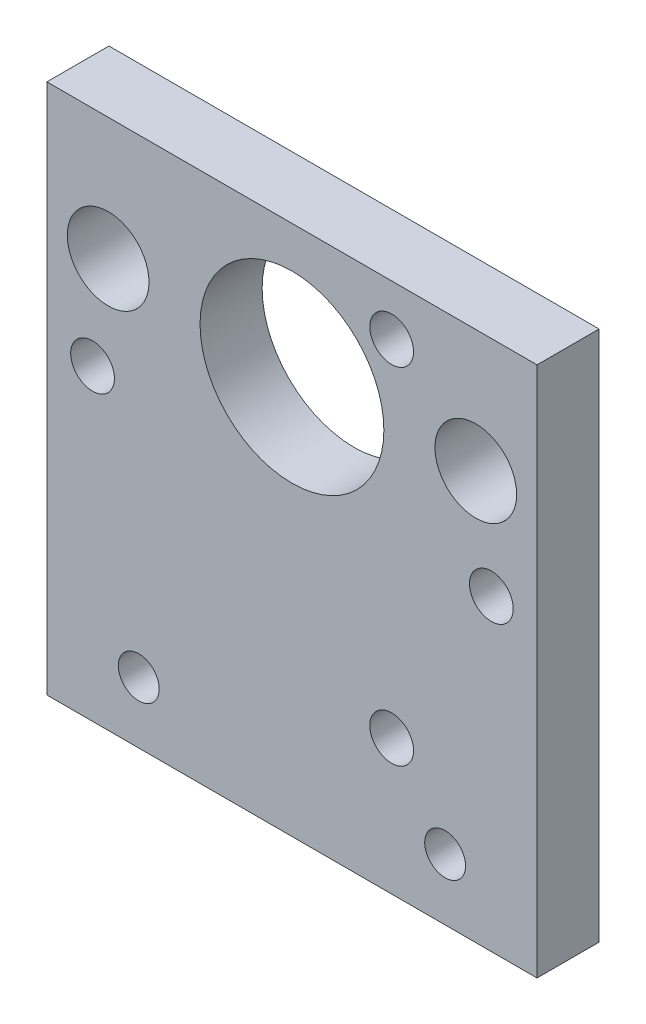
ISO-10303-21;
HEADER;
FILE_DESCRIPTION(('STEP AP214'),'2;1');
FILE_NAME('part.step','',(''),(''),'','','');
FILE_SCHEMA(('AUTOMOTIVE_DESIGN { 1 0 10303 214 1 1 1 1 }'));
ENDSEC;
DATA;
#1=APPLICATION_CONTEXT('core data for automotive mechanical design processes');
#2=APPLICATION_PROTOCOL_DEFINITION('international standard','automotive_design',2000,#1);
#3=PRODUCT_CONTEXT('',#1,'mechanical');
#4=PRODUCT('Part','Part','',(#3));
#5=PRODUCT_RELATED_PRODUCT_CATEGORY('part','',(#4));
#6=PRODUCT_DEFINITION_FORMATION('','',#4);
#7=PRODUCT_DEFINITION_CONTEXT('part definition',#1,'design');
#8=PRODUCT_DEFINITION('design','',#6,#7);
#9=PRODUCT_DEFINITION_SHAPE('','',#8);
#10=(LENGTH_UNIT() NAMED_UNIT(*) SI_UNIT(.MILLI.,.METRE.));
#11=(NAMED_UNIT(*) PLANE_ANGLE_UNIT() SI_UNIT($,.RADIAN.));
#12=(NAMED_UNIT(*) SI_UNIT($,.STERADIAN.) SOLID_ANGLE_UNIT());
#13=UNCERTAINTY_MEASURE_WITH_UNIT(LENGTH_MEASURE(1.E-05),#10,'distance_accuracy_value','');
#14=(GEOMETRIC_REPRESENTATION_CONTEXT(3) GLOBAL_UNCERTAINTY_ASSIGNED_CONTEXT((#13)) GLOBAL_UNIT_ASSIGNED_CONTEXT((#10,
#11,#12)) REPRESENTATION_CONTEXT('',''));
#15=CARTESIAN_POINT('',(0.,0.,0.));
#16=DIRECTION('',(0.,0.,1.));
#17=DIRECTION('',(1.,0.,0.));
#18=AXIS2_PLACEMENT_3D('',#15,#16,#17);
#19=CARTESIAN_POINT('',(-19.05,-20.6375,4.826));
#20=DIRECTION('',(1.,0.,0.));
#21=DIRECTION('',(0.,0.,-1.));
#22=AXIS2_PLACEMENT_3D('',#19,#20,#21);
#23=PLANE('',#22);
#24=DIRECTION('',(0.,-1.,0.));
#25=VECTOR('',#24,1.);
#26=CARTESIAN_POINT('',(-19.05,-20.6375,0.));
#27=LINE('',#26,#25);
#28=CARTESIAN_POINT('',(-19.05,20.6375,0.));
#29=VERTEX_POINT('',#28);
#30=CARTESIAN_POINT('',(-19.05,-20.6375,0.));
#31=VERTEX_POINT('',#30);
#32=EDGE_CURVE('E96',#29,#31,#27,.T.);
#33=ORIENTED_EDGE('',*,*,#32,.T.);
#34=DIRECTION('',(0.,0.,-1.));
#35=VECTOR('',#34,1.);
#36=CARTESIAN_POINT('',(-19.05,-20.6375,4.826));
#37=LINE('',#36,#35);
#38=CARTESIAN_POINT('',(-19.05,-20.6375,4.826));
#39=VERTEX_POINT('',#38);
#40=EDGE_CURVE('E11',#39,#31,#37,.T.);
#41=ORIENTED_EDGE('',*,*,#40,.F.);
#42=DIRECTION('',(0.,-1.,0.));
#43=VECTOR('',#42,1.);
#44=CARTESIAN_POINT('',(-19.05,-20.6375,4.826));
#45=LINE('',#44,#43);
#46=CARTESIAN_POINT('',(-19.05,20.6375,4.826));
#47=VERTEX_POINT('',#46);
#48=EDGE_CURVE('E84',#47,#39,#45,.T.);
#49=ORIENTED_EDGE('',*,*,#48,.F.);
#50=DIRECTION('',(0.,0.,-1.));
#51=VECTOR('',#50,1.);
#52=CARTESIAN_POINT('',(-19.05,20.6375,4.826));
#53=LINE('',#52,#51);
#54=EDGE_CURVE('E92',#47,#29,#53,.T.);
#55=ORIENTED_EDGE('',*,*,#54,.T.);
#56=EDGE_LOOP('',(#33,#41,#49,#55));
#57=FACE_BOUND('',#56,.T.);
#58=ADVANCED_FACE('F33',(#57),#23,.F.);
#59=CARTESIAN_POINT('',(19.05,-20.6375,4.826));
#60=DIRECTION('',(0.,1.,0.));
#61=DIRECTION('',(-1.,0.,0.));
#62=AXIS2_PLACEMENT_3D('',#59,#60,#61);
#63=PLANE('',#62);
#64=DIRECTION('',(1.,0.,0.));
#65=VECTOR('',#64,1.);
#66=CARTESIAN_POINT('',(19.05,-20.6375,0.));
#67=LINE('',#66,#65);
#68=CARTESIAN_POINT('',(19.05,-20.6375,0.));
#69=VERTEX_POINT('',#68);
#70=EDGE_CURVE('E88',#31,#69,#67,.T.);
#71=ORIENTED_EDGE('',*,*,#70,.T.);
#72=DIRECTION('',(0.,0.,-1.));
#73=VECTOR('',#72,1.);
#74=CARTESIAN_POINT('',(19.05,-20.6375,4.826));
#75=LINE('',#74,#73);
#76=CARTESIAN_POINT('',(19.05,-20.6375,4.826));
#77=VERTEX_POINT('',#76);
#78=EDGE_CURVE('E41',#77,#69,#75,.T.);
#79=ORIENTED_EDGE('',*,*,#78,.F.);
#80=DIRECTION('',(1.,0.,0.));
#81=VECTOR('',#80,1.);
#82=CARTESIAN_POINT('',(19.05,-20.6375,4.826));
#83=LINE('',#82,#81);
#84=EDGE_CURVE('E79',#39,#77,#83,.T.);
#85=ORIENTED_EDGE('',*,*,#84,.F.);
#86=ORIENTED_EDGE('',*,*,#40,.T.);
#87=EDGE_LOOP('',(#71,#79,#85,#86));
#88=FACE_BOUND('',#87,.T.);
#89=ADVANCED_FACE('F87',(#88),#63,.F.);
#90=CARTESIAN_POINT('',(19.05,-20.6375,4.826));
#91=DIRECTION('',(-1.,0.,0.));
#92=DIRECTION('',(0.,0.,1.));
#93=AXIS2_PLACEMENT_3D('',#90,#91,#92);
#94=PLANE('',#93);
#95=DIRECTION('',(0.,1.,0.));
#96=VECTOR('',#95,1.);
#97=CARTESIAN_POINT('',(19.05,-20.6375,0.));
#98=LINE('',#97,#96);
#99=CARTESIAN_POINT('',(19.05,20.6375,0.));
#100=VERTEX_POINT('',#99);
#101=EDGE_CURVE('E66',#69,#100,#98,.T.);
#102=ORIENTED_EDGE('',*,*,#101,.T.);
#103=DIRECTION('',(0.,0.,-1.));
#104=VECTOR('',#103,1.);
#105=CARTESIAN_POINT('',(19.05,20.6375,4.826));
#106=LINE('',#105,#104);
#107=CARTESIAN_POINT('',(19.05,20.6375,4.826));
#108=VERTEX_POINT('',#107);
#109=EDGE_CURVE('E89',#108,#100,#106,.T.);
#110=ORIENTED_EDGE('',*,*,#109,.F.);
#111=DIRECTION('',(0.,1.,0.));
#112=VECTOR('',#111,1.);
#113=CARTESIAN_POINT('',(19.05,-20.6375,4.826));
#114=LINE('',#113,#112);
#115=EDGE_CURVE('E82',#77,#108,#114,.T.);
#116=ORIENTED_EDGE('',*,*,#115,.F.);
#117=ORIENTED_EDGE('',*,*,#78,.T.);
#118=EDGE_LOOP('',(#102,#110,#116,#117));
#119=FACE_BOUND('',#118,.T.);
#120=ADVANCED_FACE('F90',(#119),#94,.F.);
#121=CARTESIAN_POINT('',(19.05,20.6375,4.826));
#122=DIRECTION('',(0.,-1.,0.));
#123=DIRECTION('',(1.,0.,0.));
#124=AXIS2_PLACEMENT_3D('',#121,#122,#123);
#125=PLANE('',#124);
#126=DIRECTION('',(-1.,0.,0.));
#127=VECTOR('',#126,1.);
#128=CARTESIAN_POINT('',(19.05,20.6375,0.));
#129=LINE('',#128,#127);
#130=EDGE_CURVE('E72',#100,#29,#129,.T.);
#131=ORIENTED_EDGE('',*,*,#130,.T.);
#132=ORIENTED_EDGE('',*,*,#54,.F.);
#133=DIRECTION('',(-1.,0.,0.));
#134=VECTOR('',#133,1.);
#135=CARTESIAN_POINT('',(19.05,20.6375,4.826));
#136=LINE('',#135,#134);
#137=EDGE_CURVE('E49',#108,#47,#136,.T.);
#138=ORIENTED_EDGE('',*,*,#137,.F.);
#139=ORIENTED_EDGE('',*,*,#109,.T.);
#140=EDGE_LOOP('',(#131,#132,#138,#139));
#141=FACE_BOUND('',#140,.T.);
#142=ADVANCED_FACE('F104',(#141),#125,.F.);
#143=CARTESIAN_POINT('',(0.,0.,4.826));
#144=DIRECTION('',(0.,0.,1.));
#145=DIRECTION('',(1.,0.,0.));
#146=AXIS2_PLACEMENT_3D('',#143,#144,#145);
#147=PLANE('',#146);
#148=CARTESIAN_POINT('',(-11.90625,-15.875,4.826));
#149=DIRECTION('',(0.,0.,1.));
#150=DIRECTION('',(1.,0.,0.));
#151=AXIS2_PLACEMENT_3D('',#148,#149,#150);
#152=CIRCLE('',#151,1.58749999999999);
#153=CARTESIAN_POINT('',(-10.31875,-15.875,4.826));
#154=VERTEX_POINT('',#153);
#155=EDGE_CURVE('E160',#154,#154,#152,.T.);
#156=ORIENTED_EDGE('',*,*,#155,.F.);
#157=EDGE_LOOP('',(#156));
#158=FACE_BOUND('',#157,.T.);
#159=CARTESIAN_POINT('',(11.90625,-15.875,4.826));
#160=DIRECTION('',(0.,0.,1.));
#161=DIRECTION('',(1.,0.,0.));
#162=AXIS2_PLACEMENT_3D('',#159,#160,#161);
#163=CIRCLE('',#162,1.58749999999999);
#164=CARTESIAN_POINT('',(13.49375,-15.875,4.826));
#165=VERTEX_POINT('',#164);
#166=EDGE_CURVE('E154',#165,#165,#163,.T.);
#167=ORIENTED_EDGE('',*,*,#166,.F.);
#168=EDGE_LOOP('',(#167));
#169=FACE_BOUND('',#168,.T.);
#170=CARTESIAN_POINT('',(-14.2875,11.1125,4.826));
#171=DIRECTION('',(0.,0.,1.));
#172=DIRECTION('',(1.,0.,0.));
#173=AXIS2_PLACEMENT_3D('',#170,#171,#172);
#174=CIRCLE('',#173,3.175);
#175=CARTESIAN_POINT('',(-11.1125,11.1125,4.826));
#176=VERTEX_POINT('',#175);
#177=EDGE_CURVE('E148',#176,#176,#174,.T.);
#178=ORIENTED_EDGE('',*,*,#177,.F.);
#179=EDGE_LOOP('',(#178));
#180=FACE_BOUND('',#179,.T.);
#181=CARTESIAN_POINT('',(14.2875,11.1125,4.826));
#182=DIRECTION('',(0.,0.,1.));
#183=DIRECTION('',(1.,0.,0.));
#184=AXIS2_PLACEMENT_3D('',#181,#182,#183);
#185=CIRCLE('',#184,3.175);
#186=CARTESIAN_POINT('',(17.4625,11.1125,4.826));
#187=VERTEX_POINT('',#186);
#188=EDGE_CURVE('E142',#187,#187,#185,.T.);
#189=ORIENTED_EDGE('',*,*,#188,.F.);
#190=EDGE_LOOP('',(#189));
#191=FACE_BOUND('',#190,.T.);
#192=CARTESIAN_POINT('',(-15.5,3.287,4.826));
#193=DIRECTION('',(0.,0.,1.));
#194=DIRECTION('',(1.,0.,0.));
#195=AXIS2_PLACEMENT_3D('',#192,#193,#194);
#196=CIRCLE('',#195,1.7);
#197=CARTESIAN_POINT('',(-13.8,3.287,4.826));
#198=VERTEX_POINT('',#197);
#199=EDGE_CURVE('E136',#198,#198,#196,.T.);
#200=ORIENTED_EDGE('',*,*,#199,.F.);
#201=EDGE_LOOP('',(#200));
#202=FACE_BOUND('',#201,.T.);
#203=CARTESIAN_POINT('',(7.75000000000002,16.7103937586588,4.826));
#204=DIRECTION('',(0.,0.,1.));
#205=DIRECTION('',(1.,0.,0.));
#206=AXIS2_PLACEMENT_3D('',#203,#204,#205);
#207=CIRCLE('',#206,1.7);
#208=CARTESIAN_POINT('',(9.45000000000001,16.7103937586588,4.826));
#209=VERTEX_POINT('',#208);
#210=EDGE_CURVE('E130',#209,#209,#207,.T.);
#211=ORIENTED_EDGE('',*,*,#210,.F.);
#212=EDGE_LOOP('',(#211));
#213=FACE_BOUND('',#212,.T.);
#214=CARTESIAN_POINT('',(15.5,3.287,4.826));
#215=DIRECTION('',(0.,0.,1.));
#216=DIRECTION('',(1.,0.,0.));
#217=AXIS2_PLACEMENT_3D('',#214,#215,#216);
#218=CIRCLE('',#217,1.7);
#219=CARTESIAN_POINT('',(17.2,3.287,4.826));
#220=VERTEX_POINT('',#219);
#221=EDGE_CURVE('E124',#220,#220,#218,.T.);
#222=ORIENTED_EDGE('',*,*,#221,.F.);
#223=EDGE_LOOP('',(#222));
#224=FACE_BOUND('',#223,.T.);
#225=CARTESIAN_POINT('',(7.75000000000002,-10.1363937586588,4.826));
#226=DIRECTION('',(0.,0.,1.));
#227=DIRECTION('',(1.,0.,0.));
#228=AXIS2_PLACEMENT_3D('',#225,#226,#227);
#229=CIRCLE('',#228,1.7);
#230=CARTESIAN_POINT('',(9.45000000000002,-10.1363937586588,4.826));
#231=VERTEX_POINT('',#230);
#232=EDGE_CURVE('E118',#231,#231,#229,.T.);
#233=ORIENTED_EDGE('',*,*,#232,.F.);
#234=EDGE_LOOP('',(#233));
#235=FACE_BOUND('',#234,.T.);
#236=CARTESIAN_POINT('',(0.,10.287,4.826));
#237=DIRECTION('',(0.,0.,1.));
#238=DIRECTION('',(1.,0.,0.));
#239=AXIS2_PLACEMENT_3D('',#236,#237,#238);
#240=CIRCLE('',#239,7.14375);
#241=CARTESIAN_POINT('',(7.14375,10.287,4.826));
#242=VERTEX_POINT('',#241);
#243=EDGE_CURVE('E110',#242,#242,#240,.T.);
#244=ORIENTED_EDGE('',*,*,#243,.F.);
#245=EDGE_LOOP('',(#244));
#246=FACE_BOUND('',#245,.T.);
#247=ORIENTED_EDGE('',*,*,#48,.T.);
#248=ORIENTED_EDGE('',*,*,#84,.T.);
#249=ORIENTED_EDGE('',*,*,#115,.T.);
#250=ORIENTED_EDGE('',*,*,#137,.T.);
#251=EDGE_LOOP('',(#247,#248,#249,#250));
#252=FACE_BOUND('',#251,.T.);
#253=ADVANCED_FACE('F80',(#158,#169,#180,#191,#202,#213,#224,#235,#246,#252),#147,.T.);
#254=CARTESIAN_POINT('',(0.,0.,0.));
#255=DIRECTION('',(0.,0.,1.));
#256=DIRECTION('',(1.,0.,0.));
#257=AXIS2_PLACEMENT_3D('',#254,#255,#256);
#258=PLANE('',#257);
#259=CARTESIAN_POINT('',(-11.90625,-15.875,0.));
#260=DIRECTION('',(0.,0.,1.));
#261=DIRECTION('',(1.,0.,0.));
#262=AXIS2_PLACEMENT_3D('',#259,#260,#261);
#263=CIRCLE('',#262,1.5875);
#264=CARTESIAN_POINT('',(-10.31875,-15.875,0.));
#265=VERTEX_POINT('',#264);
#266=EDGE_CURVE('E157',#265,#265,#263,.T.);
#267=ORIENTED_EDGE('',*,*,#266,.T.);
#268=EDGE_LOOP('',(#267));
#269=FACE_BOUND('',#268,.T.);
#270=CARTESIAN_POINT('',(11.90625,-15.875,0.));
#271=DIRECTION('',(0.,0.,1.));
#272=DIRECTION('',(1.,0.,0.));
#273=AXIS2_PLACEMENT_3D('',#270,#271,#272);
#274=CIRCLE('',#273,1.5875);
#275=CARTESIAN_POINT('',(13.49375,-15.875,0.));
#276=VERTEX_POINT('',#275);
#277=EDGE_CURVE('E151',#276,#276,#274,.T.);
#278=ORIENTED_EDGE('',*,*,#277,.T.);
#279=EDGE_LOOP('',(#278));
#280=FACE_BOUND('',#279,.T.);
#281=CARTESIAN_POINT('',(-14.2875,11.1125,0.));
#282=DIRECTION('',(0.,0.,1.));
#283=DIRECTION('',(1.,0.,0.));
#284=AXIS2_PLACEMENT_3D('',#281,#282,#283);
#285=CIRCLE('',#284,3.175);
#286=CARTESIAN_POINT('',(-11.1125,11.1125,0.));
#287=VERTEX_POINT('',#286);
#288=EDGE_CURVE('E145',#287,#287,#285,.T.);
#289=ORIENTED_EDGE('',*,*,#288,.T.);
#290=EDGE_LOOP('',(#289));
#291=FACE_BOUND('',#290,.T.);
#292=CARTESIAN_POINT('',(14.2875,11.1125,0.));
#293=DIRECTION('',(0.,0.,1.));
#294=DIRECTION('',(1.,0.,0.));
#295=AXIS2_PLACEMENT_3D('',#292,#293,#294);
#296=CIRCLE('',#295,3.175);
#297=CARTESIAN_POINT('',(17.4625,11.1125,0.));
#298=VERTEX_POINT('',#297);
#299=EDGE_CURVE('E139',#298,#298,#296,.T.);
#300=ORIENTED_EDGE('',*,*,#299,.T.);
#301=EDGE_LOOP('',(#300));
#302=FACE_BOUND('',#301,.T.);
#303=CARTESIAN_POINT('',(-15.5,3.287,0.));
#304=DIRECTION('',(0.,0.,1.));
#305=DIRECTION('',(1.,0.,0.));
#306=AXIS2_PLACEMENT_3D('',#303,#304,#305);
#307=CIRCLE('',#306,1.7);
#308=CARTESIAN_POINT('',(-13.8,3.287,0.));
#309=VERTEX_POINT('',#308);
#310=EDGE_CURVE('E133',#309,#309,#307,.T.);
#311=ORIENTED_EDGE('',*,*,#310,.T.);
#312=EDGE_LOOP('',(#311));
#313=FACE_BOUND('',#312,.T.);
#314=CARTESIAN_POINT('',(7.75000000000002,16.7103937586588,0.));
#315=DIRECTION('',(0.,0.,1.));
#316=DIRECTION('',(1.,0.,0.));
#317=AXIS2_PLACEMENT_3D('',#314,#315,#316);
#318=CIRCLE('',#317,1.7);
#319=CARTESIAN_POINT('',(9.45000000000001,16.7103937586588,0.));
#320=VERTEX_POINT('',#319);
#321=EDGE_CURVE('E127',#320,#320,#318,.T.);
#322=ORIENTED_EDGE('',*,*,#321,.T.);
#323=EDGE_LOOP('',(#322));
#324=FACE_BOUND('',#323,.T.);
#325=CARTESIAN_POINT('',(15.5,3.287,0.));
#326=DIRECTION('',(0.,0.,1.));
#327=DIRECTION('',(1.,0.,0.));
#328=AXIS2_PLACEMENT_3D('',#325,#326,#327);
#329=CIRCLE('',#328,1.7);
#330=CARTESIAN_POINT('',(17.2,3.287,0.));
#331=VERTEX_POINT('',#330);
#332=EDGE_CURVE('E121',#331,#331,#329,.T.);
#333=ORIENTED_EDGE('',*,*,#332,.T.);
#334=EDGE_LOOP('',(#333));
#335=FACE_BOUND('',#334,.T.);
#336=CARTESIAN_POINT('',(7.75000000000002,-10.1363937586588,0.));
#337=DIRECTION('',(0.,0.,1.));
#338=DIRECTION('',(1.,0.,0.));
#339=AXIS2_PLACEMENT_3D('',#336,#337,#338);
#340=CIRCLE('',#339,1.7);
#341=CARTESIAN_POINT('',(9.45000000000002,-10.1363937586588,0.));
#342=VERTEX_POINT('',#341);
#343=EDGE_CURVE('E113',#342,#342,#340,.T.);
#344=ORIENTED_EDGE('',*,*,#343,.T.);
#345=EDGE_LOOP('',(#344));
#346=FACE_BOUND('',#345,.T.);
#347=CARTESIAN_POINT('',(0.,10.287,0.));
#348=DIRECTION('',(0.,0.,1.));
#349=DIRECTION('',(1.,0.,0.));
#350=AXIS2_PLACEMENT_3D('',#347,#348,#349);
#351=CIRCLE('',#350,7.14375);
#352=CARTESIAN_POINT('',(7.14375,10.287,0.));
#353=VERTEX_POINT('',#352);
#354=EDGE_CURVE('E99',#353,#353,#351,.T.);
#355=ORIENTED_EDGE('',*,*,#354,.T.);
#356=EDGE_LOOP('',(#355));
#357=FACE_BOUND('',#356,.T.);
#358=ORIENTED_EDGE('',*,*,#32,.F.);
#359=ORIENTED_EDGE('',*,*,#130,.F.);
#360=ORIENTED_EDGE('',*,*,#101,.F.);
#361=ORIENTED_EDGE('',*,*,#70,.F.);
#362=EDGE_LOOP('',(#358,#359,#360,#361));
#363=FACE_BOUND('',#362,.T.);
#364=ADVANCED_FACE('F107',(#269,#280,#291,#302,#313,#324,#335,#346,#357,#363),#258,.F.);
#365=CARTESIAN_POINT('',(0.,10.287,0.));
#366=DIRECTION('',(0.,0.,1.));
#367=DIRECTION('',(1.,0.,0.));
#368=AXIS2_PLACEMENT_3D('',#365,#366,#367);
#369=CYLINDRICAL_SURFACE('',#368,7.14375);
#370=ORIENTED_EDGE('',*,*,#354,.F.);
#371=EDGE_LOOP('',(#370));
#372=FACE_BOUND('',#371,.T.);
#373=ORIENTED_EDGE('',*,*,#243,.T.);
#374=EDGE_LOOP('',(#373));
#375=FACE_BOUND('',#374,.T.);
#376=ADVANCED_FACE('F185',(#372,#375),#369,.F.);
#377=CARTESIAN_POINT('',(7.75000000000002,-10.1363937586588,4.826));
#378=DIRECTION('',(0.,0.,1.));
#379=DIRECTION('',(1.,0.,0.));
#380=AXIS2_PLACEMENT_3D('',#377,#378,#379);
#381=CYLINDRICAL_SURFACE('',#380,1.7);
#382=ORIENTED_EDGE('',*,*,#343,.F.);
#383=EDGE_LOOP('',(#382));
#384=FACE_BOUND('',#383,.T.);
#385=ORIENTED_EDGE('',*,*,#232,.T.);
#386=EDGE_LOOP('',(#385));
#387=FACE_BOUND('',#386,.T.);
#388=ADVANCED_FACE('F187',(#384,#387),#381,.F.);
#389=CARTESIAN_POINT('',(15.5,3.287,4.826));
#390=DIRECTION('',(0.,0.,1.));
#391=DIRECTION('',(1.,0.,0.));
#392=AXIS2_PLACEMENT_3D('',#389,#390,#391);
#393=CYLINDRICAL_SURFACE('',#392,1.7);
#394=ORIENTED_EDGE('',*,*,#332,.F.);
#395=EDGE_LOOP('',(#394));
#396=FACE_BOUND('',#395,.T.);
#397=ORIENTED_EDGE('',*,*,#221,.T.);
#398=EDGE_LOOP('',(#397));
#399=FACE_BOUND('',#398,.T.);
#400=ADVANCED_FACE('F194',(#396,#399),#393,.F.);
#401=CARTESIAN_POINT('',(7.75000000000002,16.7103937586588,4.826));
#402=DIRECTION('',(0.,0.,1.));
#403=DIRECTION('',(1.,0.,0.));
#404=AXIS2_PLACEMENT_3D('',#401,#402,#403);
#405=CYLINDRICAL_SURFACE('',#404,1.7);
#406=ORIENTED_EDGE('',*,*,#321,.F.);
#407=EDGE_LOOP('',(#406));
#408=FACE_BOUND('',#407,.T.);
#409=ORIENTED_EDGE('',*,*,#210,.T.);
#410=EDGE_LOOP('',(#409));
#411=FACE_BOUND('',#410,.T.);
#412=ADVANCED_FACE('F261',(#408,#411),#405,.F.);
#413=CARTESIAN_POINT('',(-15.5,3.287,4.826));
#414=DIRECTION('',(0.,0.,1.));
#415=DIRECTION('',(1.,0.,0.));
#416=AXIS2_PLACEMENT_3D('',#413,#414,#415);
#417=CYLINDRICAL_SURFACE('',#416,1.7);
#418=ORIENTED_EDGE('',*,*,#310,.F.);
#419=EDGE_LOOP('',(#418));
#420=FACE_BOUND('',#419,.T.);
#421=ORIENTED_EDGE('',*,*,#199,.T.);
#422=EDGE_LOOP('',(#421));
#423=FACE_BOUND('',#422,.T.);
#424=ADVANCED_FACE('F257',(#420,#423),#417,.F.);
#425=CARTESIAN_POINT('',(14.2875,11.1125,4.826));
#426=DIRECTION('',(0.,0.,1.));
#427=DIRECTION('',(1.,0.,0.));
#428=AXIS2_PLACEMENT_3D('',#425,#426,#427);
#429=CYLINDRICAL_SURFACE('',#428,3.175);
#430=ORIENTED_EDGE('',*,*,#299,.F.);
#431=EDGE_LOOP('',(#430));
#432=FACE_BOUND('',#431,.T.);
#433=ORIENTED_EDGE('',*,*,#188,.T.);
#434=EDGE_LOOP('',(#433));
#435=FACE_BOUND('',#434,.T.);
#436=ADVANCED_FACE('F253',(#432,#435),#429,.F.);
#437=CARTESIAN_POINT('',(-14.2875,11.1125,4.826));
#438=DIRECTION('',(0.,0.,1.));
#439=DIRECTION('',(1.,0.,0.));
#440=AXIS2_PLACEMENT_3D('',#437,#438,#439);
#441=CYLINDRICAL_SURFACE('',#440,3.175);
#442=ORIENTED_EDGE('',*,*,#288,.F.);
#443=EDGE_LOOP('',(#442));
#444=FACE_BOUND('',#443,.T.);
#445=ORIENTED_EDGE('',*,*,#177,.T.);
#446=EDGE_LOOP('',(#445));
#447=FACE_BOUND('',#446,.T.);
#448=ADVANCED_FACE('F234',(#444,#447),#441,.F.);
#449=CARTESIAN_POINT('',(11.90625,-15.875,4.826));
#450=DIRECTION('',(0.,0.,1.));
#451=DIRECTION('',(1.,0.,0.));
#452=AXIS2_PLACEMENT_3D('',#449,#450,#451);
#453=CYLINDRICAL_SURFACE('',#452,1.58749999999999);
#454=ORIENTED_EDGE('',*,*,#277,.F.);
#455=EDGE_LOOP('',(#454));
#456=FACE_BOUND('',#455,.T.);
#457=ORIENTED_EDGE('',*,*,#166,.T.);
#458=EDGE_LOOP('',(#457));
#459=FACE_BOUND('',#458,.T.);
#460=ADVANCED_FACE('F229',(#456,#459),#453,.F.);
#461=CARTESIAN_POINT('',(-11.90625,-15.875,4.826));
#462=DIRECTION('',(0.,0.,1.));
#463=DIRECTION('',(1.,0.,0.));
#464=AXIS2_PLACEMENT_3D('',#461,#462,#463);
#465=CYLINDRICAL_SURFACE('',#464,1.58749999999999);
#466=ORIENTED_EDGE('',*,*,#266,.F.);
#467=EDGE_LOOP('',(#466));
#468=FACE_BOUND('',#467,.T.);
#469=ORIENTED_EDGE('',*,*,#155,.T.);
#470=EDGE_LOOP('',(#469));
#471=FACE_BOUND('',#470,.T.);
#472=ADVANCED_FACE('F164',(#468,#471),#465,.F.);
#473=CLOSED_SHELL('',(#58,#89,#120,#142,#253,#364,#376,#388,#400,#412,#424,#436,#448,#460,#472));
#474=MANIFOLD_SOLID_BREP('B2',#473);
#475=ADVANCED_BREP_SHAPE_REPRESENTATION('',(#18,#474),#14);
#476=SHAPE_DEFINITION_REPRESENTATION(#9,#475);
ENDSEC;
END-ISO-10303-21;
